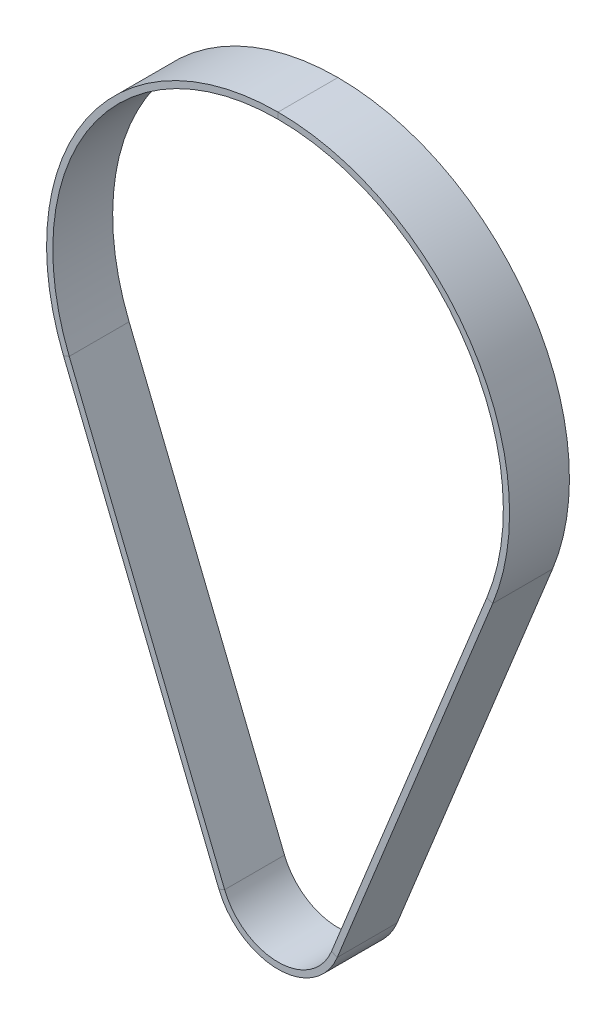
ISO-10303-21;
HEADER;
FILE_DESCRIPTION(('STEP AP214'),'2;1');
FILE_NAME('part.step','',(''),(''),'','','');
FILE_SCHEMA(('AUTOMOTIVE_DESIGN { 1 0 10303 214 1 1 1 1 }'));
ENDSEC;
DATA;
#1=APPLICATION_CONTEXT('core data for automotive mechanical design processes');
#2=APPLICATION_PROTOCOL_DEFINITION('international standard','automotive_design',2000,#1);
#3=PRODUCT_CONTEXT('',#1,'mechanical');
#4=PRODUCT('Part','Part','',(#3));
#5=PRODUCT_RELATED_PRODUCT_CATEGORY('part','',(#4));
#6=PRODUCT_DEFINITION_FORMATION('','',#4);
#7=PRODUCT_DEFINITION_CONTEXT('part definition',#1,'design');
#8=PRODUCT_DEFINITION('design','',#6,#7);
#9=PRODUCT_DEFINITION_SHAPE('','',#8);
#10=(LENGTH_UNIT() NAMED_UNIT(*) SI_UNIT(.MILLI.,.METRE.));
#11=(NAMED_UNIT(*) PLANE_ANGLE_UNIT() SI_UNIT($,.RADIAN.));
#12=(NAMED_UNIT(*) SI_UNIT($,.STERADIAN.) SOLID_ANGLE_UNIT());
#13=UNCERTAINTY_MEASURE_WITH_UNIT(LENGTH_MEASURE(1.E-05),#10,'distance_accuracy_value','');
#14=(GEOMETRIC_REPRESENTATION_CONTEXT(3) GLOBAL_UNCERTAINTY_ASSIGNED_CONTEXT((#13)) GLOBAL_UNIT_ASSIGNED_CONTEXT((#10,
#11,#12)) REPRESENTATION_CONTEXT('',''));
#15=CARTESIAN_POINT('',(0.,0.,0.));
#16=DIRECTION('',(0.,0.,1.));
#17=DIRECTION('',(1.,0.,0.));
#18=AXIS2_PLACEMENT_3D('',#15,#16,#17);
#19=CARTESIAN_POINT('',(0.,0.,0.));
#20=DIRECTION('',(0.,0.,-1.));
#21=DIRECTION('',(-1.,0.,0.));
#22=AXIS2_PLACEMENT_3D('',#19,#20,#21);
#23=CYLINDRICAL_SURFACE('',#22,58.);
#24=CARTESIAN_POINT('',(0.,0.,0.));
#25=DIRECTION('',(0.,0.,-1.));
#26=DIRECTION('',(-0.927024810886958,-0.374999999999999,0.));
#27=AXIS2_PLACEMENT_3D('',#24,#25,#26);
#28=CIRCLE('',#27,58.);
#29=CARTESIAN_POINT('',(-53.7674390314436,-21.75,0.));
#30=VERTEX_POINT('',#29);
#31=CARTESIAN_POINT('',(0.,58.,0.));
#32=VERTEX_POINT('',#31);
#33=EDGE_CURVE('E11',#30,#32,#28,.T.);
#34=ORIENTED_EDGE('',*,*,#33,.F.);
#35=DIRECTION('',(0.,0.,1.));
#36=VECTOR('',#35,1.);
#37=CARTESIAN_POINT('',(-53.7674390314436,-21.75,15.));
#38=LINE('',#37,#36);
#39=CARTESIAN_POINT('',(-53.7674390314436,-21.75,15.));
#40=VERTEX_POINT('',#39);
#41=EDGE_CURVE('E42',#30,#40,#38,.T.);
#42=ORIENTED_EDGE('',*,*,#41,.T.);
#43=CARTESIAN_POINT('',(0.,0.,15.));
#44=DIRECTION('',(0.,0.,-1.));
#45=DIRECTION('',(-0.927024810886958,-0.374999999999999,0.));
#46=AXIS2_PLACEMENT_3D('',#43,#44,#45);
#47=CIRCLE('',#46,58.);
#48=CARTESIAN_POINT('',(0.,58.,15.));
#49=VERTEX_POINT('',#48);
#50=EDGE_CURVE('E130',#40,#49,#47,.T.);
#51=ORIENTED_EDGE('',*,*,#50,.T.);
#52=DIRECTION('',(0.,0.,1.));
#53=VECTOR('',#52,1.);
#54=CARTESIAN_POINT('',(0.,58.,15.));
#55=LINE('',#54,#53);
#56=EDGE_CURVE('E133',#32,#49,#55,.T.);
#57=ORIENTED_EDGE('',*,*,#56,.F.);
#58=EDGE_LOOP('',(#34,#42,#51,#57));
#59=FACE_BOUND('',#58,.T.);
#60=ADVANCED_FACE('F39',(#59),#23,.T.);
#61=CARTESIAN_POINT('',(-53.7674390314436,-21.75,0.));
#62=DIRECTION('',(0.,0.,-1.));
#63=DIRECTION('',(-1.,0.,0.));
#64=AXIS2_PLACEMENT_3D('',#61,#62,#63);
#65=PLANE('',#64);
#66=CARTESIAN_POINT('',(0.,0.,0.));
#67=DIRECTION('',(0.,0.,-1.));
#68=DIRECTION('',(-0.927024810886958,-0.374999999999999,0.));
#69=AXIS2_PLACEMENT_3D('',#66,#67,#68);
#70=CIRCLE('',#69,56.44);
#71=CARTESIAN_POINT('',(-52.3212803264599,-21.165,0.));
#72=VERTEX_POINT('',#71);
#73=CARTESIAN_POINT('',(0.,56.44,0.));
#74=VERTEX_POINT('',#73);
#75=EDGE_CURVE('E47',#72,#74,#70,.T.);
#76=ORIENTED_EDGE('',*,*,#75,.F.);
#77=DIRECTION('',(-0.927024810886958,-0.375,0.));
#78=VECTOR('',#77,1.);
#79=CARTESIAN_POINT('',(-53.7674390314436,-21.75,0.));
#80=LINE('',#79,#78);
#81=EDGE_CURVE('E220',#72,#30,#80,.T.);
#82=ORIENTED_EDGE('',*,*,#81,.T.);
#83=ORIENTED_EDGE('',*,*,#33,.T.);
#84=DIRECTION('',(0.,1.,0.));
#85=VECTOR('',#84,1.);
#86=CARTESIAN_POINT('',(0.,58.,0.));
#87=LINE('',#86,#85);
#88=EDGE_CURVE('E158',#74,#32,#87,.T.);
#89=ORIENTED_EDGE('',*,*,#88,.F.);
#90=EDGE_LOOP('',(#76,#82,#83,#89));
#91=FACE_BOUND('',#90,.T.);
#92=ADVANCED_FACE('F267',(#91),#65,.T.);
#93=CARTESIAN_POINT('',(0.,0.,0.));
#94=DIRECTION('',(0.,0.,-1.));
#95=DIRECTION('',(-1.,0.,0.));
#96=AXIS2_PLACEMENT_3D('',#93,#94,#95);
#97=CYLINDRICAL_SURFACE('',#96,56.44);
#98=CARTESIAN_POINT('',(0.,0.,15.));
#99=DIRECTION('',(0.,0.,-1.));
#100=DIRECTION('',(-0.927024810886958,-0.374999999999999,0.));
#101=AXIS2_PLACEMENT_3D('',#98,#99,#100);
#102=CIRCLE('',#101,56.44);
#103=CARTESIAN_POINT('',(-52.3212803264599,-21.165,15.));
#104=VERTEX_POINT('',#103);
#105=CARTESIAN_POINT('',(0.,56.44,15.));
#106=VERTEX_POINT('',#105);
#107=EDGE_CURVE('E139',#104,#106,#102,.T.);
#108=ORIENTED_EDGE('',*,*,#107,.F.);
#109=DIRECTION('',(0.,0.,-1.));
#110=VECTOR('',#109,1.);
#111=CARTESIAN_POINT('',(-52.3212803264599,-21.165,15.));
#112=LINE('',#111,#110);
#113=EDGE_CURVE('E195',#104,#72,#112,.T.);
#114=ORIENTED_EDGE('',*,*,#113,.T.);
#115=ORIENTED_EDGE('',*,*,#75,.T.);
#116=DIRECTION('',(0.,0.,-1.));
#117=VECTOR('',#116,1.);
#118=CARTESIAN_POINT('',(0.,56.44,15.));
#119=LINE('',#118,#117);
#120=EDGE_CURVE('E162',#106,#74,#119,.T.);
#121=ORIENTED_EDGE('',*,*,#120,.F.);
#122=EDGE_LOOP('',(#108,#114,#115,#121));
#123=FACE_BOUND('',#122,.T.);
#124=ADVANCED_FACE('F271',(#123),#97,.F.);
#125=CARTESIAN_POINT('',(-14.8323969741913,-118.,15.));
#126=DIRECTION('',(-0.927024810886958,-0.375,0.));
#127=DIRECTION('',(0.375,-0.927024810886958,0.));
#128=AXIS2_PLACEMENT_3D('',#125,#126,#127);
#129=PLANE('',#128);
#130=ORIENTED_EDGE('',*,*,#41,.F.);
#131=DIRECTION('',(-0.375,0.927024810886958,0.));
#132=VECTOR('',#131,1.);
#133=CARTESIAN_POINT('',(-14.8323969741913,-118.,0.));
#134=LINE('',#133,#132);
#135=CARTESIAN_POINT('',(-14.8323969741913,-118.,0.));
#136=VERTEX_POINT('',#135);
#137=EDGE_CURVE('E234',#136,#30,#134,.T.);
#138=ORIENTED_EDGE('',*,*,#137,.F.);
#139=DIRECTION('',(0.,0.,1.));
#140=VECTOR('',#139,1.);
#141=CARTESIAN_POINT('',(-14.8323969741913,-118.,15.));
#142=LINE('',#141,#140);
#143=CARTESIAN_POINT('',(-14.8323969741913,-118.,15.));
#144=VERTEX_POINT('',#143);
#145=EDGE_CURVE('E198',#136,#144,#142,.T.);
#146=ORIENTED_EDGE('',*,*,#145,.T.);
#147=DIRECTION('',(-0.375,0.927024810886958,0.));
#148=VECTOR('',#147,1.);
#149=CARTESIAN_POINT('',(-14.8323969741913,-118.,15.));
#150=LINE('',#149,#148);
#151=EDGE_CURVE('E192',#144,#40,#150,.T.);
#152=ORIENTED_EDGE('',*,*,#151,.T.);
#153=EDGE_LOOP('',(#130,#138,#146,#152));
#154=FACE_BOUND('',#153,.T.);
#155=ADVANCED_FACE('F243',(#154),#129,.T.);
#156=CARTESIAN_POINT('',(-14.8323969741913,-118.,0.));
#157=DIRECTION('',(0.,0.,-1.));
#158=DIRECTION('',(-1.,0.,0.));
#159=AXIS2_PLACEMENT_3D('',#156,#157,#158);
#160=PLANE('',#159);
#161=ORIENTED_EDGE('',*,*,#137,.T.);
#162=ORIENTED_EDGE('',*,*,#81,.F.);
#163=DIRECTION('',(-0.375,0.927024810886958,0.));
#164=VECTOR('',#163,1.);
#165=CARTESIAN_POINT('',(-13.3862382692077,-117.415,0.));
#166=LINE('',#165,#164);
#167=CARTESIAN_POINT('',(-13.3862382692077,-117.415,0.));
#168=VERTEX_POINT('',#167);
#169=EDGE_CURVE('E217',#168,#72,#166,.T.);
#170=ORIENTED_EDGE('',*,*,#169,.F.);
#171=DIRECTION('',(-0.927024810886958,-0.374999999999999,0.));
#172=VECTOR('',#171,1.);
#173=CARTESIAN_POINT('',(-14.8323969741913,-118.,0.));
#174=LINE('',#173,#172);
#175=EDGE_CURVE('E213',#168,#136,#174,.T.);
#176=ORIENTED_EDGE('',*,*,#175,.T.);
#177=EDGE_LOOP('',(#161,#162,#170,#176));
#178=FACE_BOUND('',#177,.T.);
#179=ADVANCED_FACE('F280',(#178),#160,.T.);
#180=CARTESIAN_POINT('',(-13.3862382692077,-117.415,15.));
#181=DIRECTION('',(0.927024810886958,0.375,0.));
#182=DIRECTION('',(-0.375,0.927024810886958,0.));
#183=AXIS2_PLACEMENT_3D('',#180,#181,#182);
#184=PLANE('',#183);
#185=ORIENTED_EDGE('',*,*,#169,.T.);
#186=ORIENTED_EDGE('',*,*,#113,.F.);
#187=DIRECTION('',(-0.375,0.927024810886958,0.));
#188=VECTOR('',#187,1.);
#189=CARTESIAN_POINT('',(-13.3862382692077,-117.415,15.));
#190=LINE('',#189,#188);
#191=CARTESIAN_POINT('',(-13.3862382692077,-117.415,15.));
#192=VERTEX_POINT('',#191);
#193=EDGE_CURVE('E191',#192,#104,#190,.T.);
#194=ORIENTED_EDGE('',*,*,#193,.F.);
#195=DIRECTION('',(0.,0.,-1.));
#196=VECTOR('',#195,1.);
#197=CARTESIAN_POINT('',(-13.3862382692077,-117.415,15.));
#198=LINE('',#197,#196);
#199=EDGE_CURVE('E184',#192,#168,#198,.T.);
#200=ORIENTED_EDGE('',*,*,#199,.T.);
#201=EDGE_LOOP('',(#185,#186,#194,#200));
#202=FACE_BOUND('',#201,.T.);
#203=ADVANCED_FACE('F251',(#202),#184,.T.);
#204=CARTESIAN_POINT('',(-14.8323969741913,-118.,15.));
#205=DIRECTION('',(0.,0.,1.));
#206=DIRECTION('',(1.,0.,0.));
#207=AXIS2_PLACEMENT_3D('',#204,#205,#206);
#208=PLANE('',#207);
#209=ORIENTED_EDGE('',*,*,#193,.T.);
#210=DIRECTION('',(0.927024810886958,0.375,0.));
#211=VECTOR('',#210,1.);
#212=CARTESIAN_POINT('',(-53.7674390314436,-21.75,15.));
#213=LINE('',#212,#211);
#214=EDGE_CURVE('E189',#40,#104,#213,.T.);
#215=ORIENTED_EDGE('',*,*,#214,.F.);
#216=ORIENTED_EDGE('',*,*,#151,.F.);
#217=DIRECTION('',(0.927024810886958,0.374999999999999,0.));
#218=VECTOR('',#217,1.);
#219=CARTESIAN_POINT('',(-14.8323969741913,-118.,15.));
#220=LINE('',#219,#218);
#221=EDGE_CURVE('E181',#144,#192,#220,.T.);
#222=ORIENTED_EDGE('',*,*,#221,.T.);
#223=EDGE_LOOP('',(#209,#215,#216,#222));
#224=FACE_BOUND('',#223,.T.);
#225=ADVANCED_FACE('F248',(#224),#208,.T.);
#226=CARTESIAN_POINT('',(0.,-112.,0.));
#227=DIRECTION('',(0.,0.,-1.));
#228=DIRECTION('',(-1.,0.,0.));
#229=AXIS2_PLACEMENT_3D('',#226,#227,#228);
#230=CYLINDRICAL_SURFACE('',#229,16.);
#231=ORIENTED_EDGE('',*,*,#145,.F.);
#232=CARTESIAN_POINT('',(0.,-112.,0.));
#233=DIRECTION('',(0.,0.,-1.));
#234=DIRECTION('',(0.927024810886958,-0.375,0.));
#235=AXIS2_PLACEMENT_3D('',#232,#233,#234);
#236=CIRCLE('',#235,16.);
#237=CARTESIAN_POINT('',(14.8323969741913,-118.,0.));
#238=VERTEX_POINT('',#237);
#239=EDGE_CURVE('E88',#238,#136,#236,.T.);
#240=ORIENTED_EDGE('',*,*,#239,.F.);
#241=DIRECTION('',(0.,0.,1.));
#242=VECTOR('',#241,1.);
#243=CARTESIAN_POINT('',(14.8323969741913,-118.,15.));
#244=LINE('',#243,#242);
#245=CARTESIAN_POINT('',(14.8323969741913,-118.,15.));
#246=VERTEX_POINT('',#245);
#247=EDGE_CURVE('E188',#238,#246,#244,.T.);
#248=ORIENTED_EDGE('',*,*,#247,.T.);
#249=CARTESIAN_POINT('',(0.,-112.,15.));
#250=DIRECTION('',(0.,0.,-1.));
#251=DIRECTION('',(0.927024810886958,-0.375,0.));
#252=AXIS2_PLACEMENT_3D('',#249,#250,#251);
#253=CIRCLE('',#252,16.);
#254=EDGE_CURVE('E186',#246,#144,#253,.T.);
#255=ORIENTED_EDGE('',*,*,#254,.T.);
#256=EDGE_LOOP('',(#231,#240,#248,#255));
#257=FACE_BOUND('',#256,.T.);
#258=ADVANCED_FACE('F262',(#257),#230,.T.);
#259=CARTESIAN_POINT('',(14.8323969741913,-118.,0.));
#260=DIRECTION('',(0.,0.,-1.));
#261=DIRECTION('',(-1.,0.,0.));
#262=AXIS2_PLACEMENT_3D('',#259,#260,#261);
#263=PLANE('',#262);
#264=ORIENTED_EDGE('',*,*,#239,.T.);
#265=ORIENTED_EDGE('',*,*,#175,.F.);
#266=CARTESIAN_POINT('',(0.,-112.,0.));
#267=DIRECTION('',(0.,0.,-1.));
#268=DIRECTION('',(0.927024810886958,-0.374999999999999,0.));
#269=AXIS2_PLACEMENT_3D('',#266,#267,#268);
#270=CIRCLE('',#269,14.44);
#271=CARTESIAN_POINT('',(13.3862382692077,-117.415,0.));
#272=VERTEX_POINT('',#271);
#273=EDGE_CURVE('E98',#272,#168,#270,.T.);
#274=ORIENTED_EDGE('',*,*,#273,.F.);
#275=DIRECTION('',(0.927024810886958,-0.375,0.));
#276=VECTOR('',#275,1.);
#277=CARTESIAN_POINT('',(14.8323969741913,-118.,0.));
#278=LINE('',#277,#276);
#279=EDGE_CURVE('E210',#272,#238,#278,.T.);
#280=ORIENTED_EDGE('',*,*,#279,.T.);
#281=EDGE_LOOP('',(#264,#265,#274,#280));
#282=FACE_BOUND('',#281,.T.);
#283=ADVANCED_FACE('F254',(#282),#263,.T.);
#284=CARTESIAN_POINT('',(0.,-112.,0.));
#285=DIRECTION('',(0.,0.,-1.));
#286=DIRECTION('',(-1.,0.,0.));
#287=AXIS2_PLACEMENT_3D('',#284,#285,#286);
#288=CYLINDRICAL_SURFACE('',#287,14.44);
#289=ORIENTED_EDGE('',*,*,#273,.T.);
#290=ORIENTED_EDGE('',*,*,#199,.F.);
#291=CARTESIAN_POINT('',(0.,-112.,15.));
#292=DIRECTION('',(0.,0.,-1.));
#293=DIRECTION('',(0.927024810886958,-0.374999999999999,0.));
#294=AXIS2_PLACEMENT_3D('',#291,#292,#293);
#295=CIRCLE('',#294,14.44);
#296=CARTESIAN_POINT('',(13.3862382692077,-117.415,15.));
#297=VERTEX_POINT('',#296);
#298=EDGE_CURVE('E106',#297,#192,#295,.T.);
#299=ORIENTED_EDGE('',*,*,#298,.F.);
#300=DIRECTION('',(0.,0.,-1.));
#301=VECTOR('',#300,1.);
#302=CARTESIAN_POINT('',(13.3862382692077,-117.415,15.));
#303=LINE('',#302,#301);
#304=EDGE_CURVE('E177',#297,#272,#303,.T.);
#305=ORIENTED_EDGE('',*,*,#304,.T.);
#306=EDGE_LOOP('',(#289,#290,#299,#305));
#307=FACE_BOUND('',#306,.T.);
#308=ADVANCED_FACE('F252',(#307),#288,.F.);
#309=CARTESIAN_POINT('',(14.8323969741913,-118.,15.));
#310=DIRECTION('',(0.,0.,1.));
#311=DIRECTION('',(1.,0.,0.));
#312=AXIS2_PLACEMENT_3D('',#309,#310,#311);
#313=PLANE('',#312);
#314=ORIENTED_EDGE('',*,*,#298,.T.);
#315=ORIENTED_EDGE('',*,*,#221,.F.);
#316=ORIENTED_EDGE('',*,*,#254,.F.);
#317=DIRECTION('',(-0.927024810886958,0.375,0.));
#318=VECTOR('',#317,1.);
#319=CARTESIAN_POINT('',(14.8323969741913,-118.,15.));
#320=LINE('',#319,#318);
#321=EDGE_CURVE('E171',#246,#297,#320,.T.);
#322=ORIENTED_EDGE('',*,*,#321,.T.);
#323=EDGE_LOOP('',(#314,#315,#316,#322));
#324=FACE_BOUND('',#323,.T.);
#325=ADVANCED_FACE('F246',(#324),#313,.T.);
#326=CARTESIAN_POINT('',(53.7674390314436,-21.75,15.));
#327=DIRECTION('',(0.927024810886958,-0.375,0.));
#328=DIRECTION('',(0.375,0.927024810886958,0.));
#329=AXIS2_PLACEMENT_3D('',#326,#327,#328);
#330=PLANE('',#329);
#331=ORIENTED_EDGE('',*,*,#247,.F.);
#332=DIRECTION('',(-0.375,-0.927024810886958,0.));
#333=VECTOR('',#332,1.);
#334=CARTESIAN_POINT('',(53.7674390314436,-21.75,0.));
#335=LINE('',#334,#333);
#336=CARTESIAN_POINT('',(53.7674390314436,-21.75,0.));
#337=VERTEX_POINT('',#336);
#338=EDGE_CURVE('E227',#337,#238,#335,.T.);
#339=ORIENTED_EDGE('',*,*,#338,.F.);
#340=DIRECTION('',(0.,0.,1.));
#341=VECTOR('',#340,1.);
#342=CARTESIAN_POINT('',(53.7674390314436,-21.75,15.));
#343=LINE('',#342,#341);
#344=CARTESIAN_POINT('',(53.7674390314436,-21.75,15.));
#345=VERTEX_POINT('',#344);
#346=EDGE_CURVE('E180',#337,#345,#343,.T.);
#347=ORIENTED_EDGE('',*,*,#346,.T.);
#348=DIRECTION('',(-0.375,-0.927024810886958,0.));
#349=VECTOR('',#348,1.);
#350=CARTESIAN_POINT('',(53.7674390314436,-21.75,15.));
#351=LINE('',#350,#349);
#352=EDGE_CURVE('E174',#345,#246,#351,.T.);
#353=ORIENTED_EDGE('',*,*,#352,.T.);
#354=EDGE_LOOP('',(#331,#339,#347,#353));
#355=FACE_BOUND('',#354,.T.);
#356=ADVANCED_FACE('F260',(#355),#330,.T.);
#357=CARTESIAN_POINT('',(53.7674390314436,-21.75,0.));
#358=DIRECTION('',(0.,0.,-1.));
#359=DIRECTION('',(-1.,0.,0.));
#360=AXIS2_PLACEMENT_3D('',#357,#358,#359);
#361=PLANE('',#360);
#362=ORIENTED_EDGE('',*,*,#338,.T.);
#363=ORIENTED_EDGE('',*,*,#279,.F.);
#364=DIRECTION('',(-0.375,-0.927024810886958,0.));
#365=VECTOR('',#364,1.);
#366=CARTESIAN_POINT('',(52.3212803264599,-21.165,0.));
#367=LINE('',#366,#365);
#368=CARTESIAN_POINT('',(52.3212803264599,-21.165,0.));
#369=VERTEX_POINT('',#368);
#370=EDGE_CURVE('E207',#369,#272,#367,.T.);
#371=ORIENTED_EDGE('',*,*,#370,.F.);
#372=DIRECTION('',(0.927024810886958,-0.375,0.));
#373=VECTOR('',#372,1.);
#374=CARTESIAN_POINT('',(53.7674390314436,-21.75,0.));
#375=LINE('',#374,#373);
#376=EDGE_CURVE('E205',#369,#337,#375,.T.);
#377=ORIENTED_EDGE('',*,*,#376,.T.);
#378=EDGE_LOOP('',(#362,#363,#371,#377));
#379=FACE_BOUND('',#378,.T.);
#380=ADVANCED_FACE('F287',(#379),#361,.T.);
#381=CARTESIAN_POINT('',(52.3212803264599,-21.165,15.));
#382=DIRECTION('',(-0.927024810886958,0.375,0.));
#383=DIRECTION('',(-0.375,-0.927024810886958,0.));
#384=AXIS2_PLACEMENT_3D('',#381,#382,#383);
#385=PLANE('',#384);
#386=ORIENTED_EDGE('',*,*,#370,.T.);
#387=ORIENTED_EDGE('',*,*,#304,.F.);
#388=DIRECTION('',(-0.375,-0.927024810886958,0.));
#389=VECTOR('',#388,1.);
#390=CARTESIAN_POINT('',(52.3212803264599,-21.165,15.));
#391=LINE('',#390,#389);
#392=CARTESIAN_POINT('',(52.3212803264599,-21.165,15.));
#393=VERTEX_POINT('',#392);
#394=EDGE_CURVE('E173',#393,#297,#391,.T.);
#395=ORIENTED_EDGE('',*,*,#394,.F.);
#396=DIRECTION('',(0.,0.,-1.));
#397=VECTOR('',#396,1.);
#398=CARTESIAN_POINT('',(52.3212803264599,-21.165,15.));
#399=LINE('',#398,#397);
#400=EDGE_CURVE('E169',#393,#369,#399,.T.);
#401=ORIENTED_EDGE('',*,*,#400,.T.);
#402=EDGE_LOOP('',(#386,#387,#395,#401));
#403=FACE_BOUND('',#402,.T.);
#404=ADVANCED_FACE('F307',(#403),#385,.T.);
#405=CARTESIAN_POINT('',(53.7674390314436,-21.75,15.));
#406=DIRECTION('',(0.,0.,1.));
#407=DIRECTION('',(1.,0.,0.));
#408=AXIS2_PLACEMENT_3D('',#405,#406,#407);
#409=PLANE('',#408);
#410=ORIENTED_EDGE('',*,*,#394,.T.);
#411=ORIENTED_EDGE('',*,*,#321,.F.);
#412=ORIENTED_EDGE('',*,*,#352,.F.);
#413=DIRECTION('',(-0.927024810886958,0.375,0.));
#414=VECTOR('',#413,1.);
#415=CARTESIAN_POINT('',(53.7674390314436,-21.75,15.));
#416=LINE('',#415,#414);
#417=EDGE_CURVE('E150',#345,#393,#416,.T.);
#418=ORIENTED_EDGE('',*,*,#417,.T.);
#419=EDGE_LOOP('',(#410,#411,#412,#418));
#420=FACE_BOUND('',#419,.T.);
#421=ADVANCED_FACE('F284',(#420),#409,.T.);
#422=CARTESIAN_POINT('',(0.,0.,0.));
#423=DIRECTION('',(0.,0.,-1.));
#424=DIRECTION('',(-1.,0.,0.));
#425=AXIS2_PLACEMENT_3D('',#422,#423,#424);
#426=CYLINDRICAL_SURFACE('',#425,58.);
#427=ORIENTED_EDGE('',*,*,#346,.F.);
#428=CARTESIAN_POINT('',(0.,0.,0.));
#429=DIRECTION('',(0.,0.,-1.));
#430=DIRECTION('',(0.,1.,0.));
#431=AXIS2_PLACEMENT_3D('',#428,#429,#430);
#432=CIRCLE('',#431,58.);
#433=EDGE_CURVE('E157',#32,#337,#432,.T.);
#434=ORIENTED_EDGE('',*,*,#433,.F.);
#435=ORIENTED_EDGE('',*,*,#56,.T.);
#436=CARTESIAN_POINT('',(0.,0.,15.));
#437=DIRECTION('',(0.,0.,-1.));
#438=DIRECTION('',(0.,1.,0.));
#439=AXIS2_PLACEMENT_3D('',#436,#437,#438);
#440=CIRCLE('',#439,58.);
#441=EDGE_CURVE('E145',#49,#345,#440,.T.);
#442=ORIENTED_EDGE('',*,*,#441,.T.);
#443=EDGE_LOOP('',(#427,#434,#435,#442));
#444=FACE_BOUND('',#443,.T.);
#445=ADVANCED_FACE('F155',(#444),#426,.T.);
#446=CARTESIAN_POINT('',(0.,58.,0.));
#447=DIRECTION('',(0.,0.,-1.));
#448=DIRECTION('',(-1.,0.,0.));
#449=AXIS2_PLACEMENT_3D('',#446,#447,#448);
#450=PLANE('',#449);
#451=ORIENTED_EDGE('',*,*,#433,.T.);
#452=ORIENTED_EDGE('',*,*,#376,.F.);
#453=CARTESIAN_POINT('',(0.,0.,0.));
#454=DIRECTION('',(0.,0.,-1.));
#455=DIRECTION('',(0.,1.,0.));
#456=AXIS2_PLACEMENT_3D('',#453,#454,#455);
#457=CIRCLE('',#456,56.44);
#458=EDGE_CURVE('E202',#74,#369,#457,.T.);
#459=ORIENTED_EDGE('',*,*,#458,.F.);
#460=ORIENTED_EDGE('',*,*,#88,.T.);
#461=EDGE_LOOP('',(#451,#452,#459,#460));
#462=FACE_BOUND('',#461,.T.);
#463=ADVANCED_FACE('F283',(#462),#450,.T.);
#464=CARTESIAN_POINT('',(0.,0.,0.));
#465=DIRECTION('',(0.,0.,-1.));
#466=DIRECTION('',(-1.,0.,0.));
#467=AXIS2_PLACEMENT_3D('',#464,#465,#466);
#468=CYLINDRICAL_SURFACE('',#467,56.44);
#469=ORIENTED_EDGE('',*,*,#458,.T.);
#470=ORIENTED_EDGE('',*,*,#400,.F.);
#471=CARTESIAN_POINT('',(0.,0.,15.));
#472=DIRECTION('',(0.,0.,-1.));
#473=DIRECTION('',(0.,1.,0.));
#474=AXIS2_PLACEMENT_3D('',#471,#472,#473);
#475=CIRCLE('',#474,56.44);
#476=EDGE_CURVE('E168',#106,#393,#475,.T.);
#477=ORIENTED_EDGE('',*,*,#476,.F.);
#478=ORIENTED_EDGE('',*,*,#120,.T.);
#479=EDGE_LOOP('',(#469,#470,#477,#478));
#480=FACE_BOUND('',#479,.T.);
#481=ADVANCED_FACE('F302',(#480),#468,.F.);
#482=CARTESIAN_POINT('',(0.,58.,15.));
#483=DIRECTION('',(0.,0.,1.));
#484=DIRECTION('',(1.,0.,0.));
#485=AXIS2_PLACEMENT_3D('',#482,#483,#484);
#486=PLANE('',#485);
#487=ORIENTED_EDGE('',*,*,#476,.T.);
#488=ORIENTED_EDGE('',*,*,#417,.F.);
#489=ORIENTED_EDGE('',*,*,#441,.F.);
#490=DIRECTION('',(0.,-1.,0.));
#491=VECTOR('',#490,1.);
#492=CARTESIAN_POINT('',(0.,58.,15.));
#493=LINE('',#492,#491);
#494=EDGE_CURVE('E148',#49,#106,#493,.T.);
#495=ORIENTED_EDGE('',*,*,#494,.T.);
#496=EDGE_LOOP('',(#487,#488,#489,#495));
#497=FACE_BOUND('',#496,.T.);
#498=ADVANCED_FACE('F147',(#497),#486,.T.);
#499=CARTESIAN_POINT('',(-53.7674390314436,-21.75,15.));
#500=DIRECTION('',(0.,0.,1.));
#501=DIRECTION('',(1.,0.,0.));
#502=AXIS2_PLACEMENT_3D('',#499,#500,#501);
#503=PLANE('',#502);
#504=ORIENTED_EDGE('',*,*,#214,.T.);
#505=ORIENTED_EDGE('',*,*,#107,.T.);
#506=ORIENTED_EDGE('',*,*,#494,.F.);
#507=ORIENTED_EDGE('',*,*,#50,.F.);
#508=EDGE_LOOP('',(#504,#505,#506,#507));
#509=FACE_BOUND('',#508,.T.);
#510=ADVANCED_FACE('F160',(#509),#503,.T.);
#511=CLOSED_SHELL('',(#60,#92,#124,#155,#179,#203,#225,#258,#283,#308,#325,#356,#380,#404,#421,
#445,#463,#481,#498,#510));
#512=MANIFOLD_SOLID_BREP('B2',#511);
#513=ADVANCED_BREP_SHAPE_REPRESENTATION('',(#18,#512),#14);
#514=SHAPE_DEFINITION_REPRESENTATION(#9,#513);
ENDSEC;
END-ISO-10303-21;
